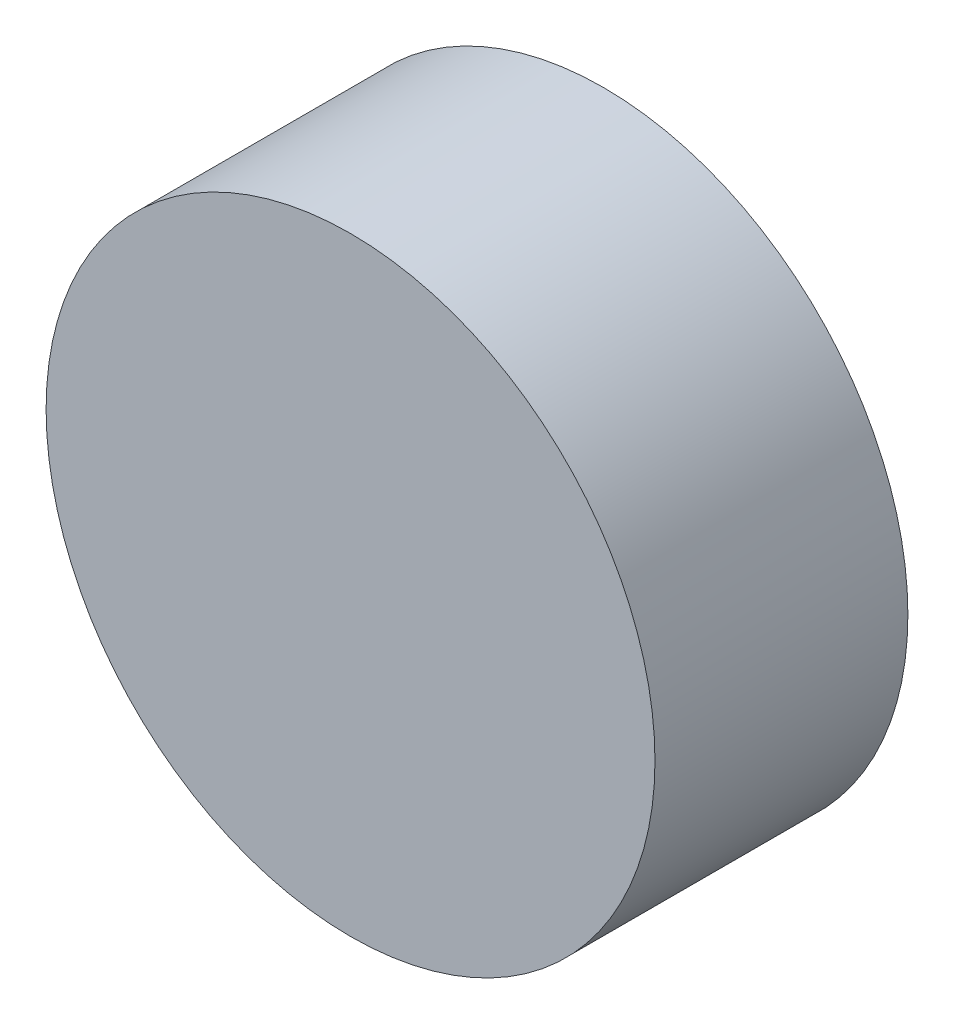
ISO-10303-21;
HEADER;
FILE_DESCRIPTION(('STEP AP214'),'2;1');
FILE_NAME('part.step','',(''),(''),'','','');
FILE_SCHEMA(('AUTOMOTIVE_DESIGN { 1 0 10303 214 1 1 1 1 }'));
ENDSEC;
DATA;
#1=APPLICATION_CONTEXT('core data for automotive mechanical design processes');
#2=APPLICATION_PROTOCOL_DEFINITION('international standard','automotive_design',2000,#1);
#3=PRODUCT_CONTEXT('',#1,'mechanical');
#4=PRODUCT('Part','Part','',(#3));
#5=PRODUCT_RELATED_PRODUCT_CATEGORY('part','',(#4));
#6=PRODUCT_DEFINITION_FORMATION('','',#4);
#7=PRODUCT_DEFINITION_CONTEXT('part definition',#1,'design');
#8=PRODUCT_DEFINITION('design','',#6,#7);
#9=PRODUCT_DEFINITION_SHAPE('','',#8);
#10=(LENGTH_UNIT() NAMED_UNIT(*) SI_UNIT(.MILLI.,.METRE.));
#11=(NAMED_UNIT(*) PLANE_ANGLE_UNIT() SI_UNIT($,.RADIAN.));
#12=(NAMED_UNIT(*) SI_UNIT($,.STERADIAN.) SOLID_ANGLE_UNIT());
#13=UNCERTAINTY_MEASURE_WITH_UNIT(LENGTH_MEASURE(1.E-05),#10,'distance_accuracy_value','');
#14=(GEOMETRIC_REPRESENTATION_CONTEXT(3) GLOBAL_UNCERTAINTY_ASSIGNED_CONTEXT((#13)) GLOBAL_UNIT_ASSIGNED_CONTEXT((#10,
#11,#12)) REPRESENTATION_CONTEXT('',''));
#15=CARTESIAN_POINT('',(0.,0.,0.));
#16=DIRECTION('',(0.,0.,1.));
#17=DIRECTION('',(1.,0.,0.));
#18=AXIS2_PLACEMENT_3D('',#15,#16,#17);
#19=CARTESIAN_POINT('',(0.,0.,27.));
#20=DIRECTION('',(0.,0.,-1.));
#21=DIRECTION('',(-1.,0.,0.));
#22=AXIS2_PLACEMENT_3D('',#19,#20,#21);
#23=CYLINDRICAL_SURFACE('',#22,32.5);
#24=CARTESIAN_POINT('',(0.,0.,27.));
#25=DIRECTION('',(0.,0.,1.));
#26=DIRECTION('',(1.,0.,0.));
#27=AXIS2_PLACEMENT_3D('',#24,#25,#26);
#28=CIRCLE('',#27,32.5);
#29=CARTESIAN_POINT('',(32.5,0.,27.));
#30=VERTEX_POINT('',#29);
#31=EDGE_CURVE('E11',#30,#30,#28,.T.);
#32=ORIENTED_EDGE('',*,*,#31,.F.);
#33=EDGE_LOOP('',(#32));
#34=FACE_BOUND('',#33,.T.);
#35=CARTESIAN_POINT('',(0.,0.,0.));
#36=DIRECTION('',(0.,0.,1.));
#37=DIRECTION('',(1.,0.,0.));
#38=AXIS2_PLACEMENT_3D('',#35,#36,#37);
#39=CIRCLE('',#38,32.5);
#40=CARTESIAN_POINT('',(32.5,0.,0.));
#41=VERTEX_POINT('',#40);
#42=EDGE_CURVE('E38',#41,#41,#39,.T.);
#43=ORIENTED_EDGE('',*,*,#42,.T.);
#44=EDGE_LOOP('',(#43));
#45=FACE_BOUND('',#44,.T.);
#46=ADVANCED_FACE('F35',(#34,#45),#23,.T.);
#47=CARTESIAN_POINT('',(0.,0.,27.));
#48=DIRECTION('',(0.,0.,1.));
#49=DIRECTION('',(1.,0.,0.));
#50=AXIS2_PLACEMENT_3D('',#47,#48,#49);
#51=PLANE('',#50);
#52=ORIENTED_EDGE('',*,*,#31,.T.);
#53=EDGE_LOOP('',(#52));
#54=FACE_BOUND('',#53,.T.);
#55=ADVANCED_FACE('F152',(#54),#51,.T.);
#56=CARTESIAN_POINT('',(0.,0.,0.));
#57=DIRECTION('',(0.,0.,1.));
#58=DIRECTION('',(1.,0.,0.));
#59=AXIS2_PLACEMENT_3D('',#56,#57,#58);
#60=PLANE('',#59);
#61=CARTESIAN_POINT('',(0.,0.,0.));
#62=DIRECTION('',(0.,0.,-1.));
#63=DIRECTION('',(-1.,0.,0.));
#64=AXIS2_PLACEMENT_3D('',#61,#62,#63);
#65=CIRCLE('',#64,20.);
#66=CARTESIAN_POINT('',(-20.,0.,0.));
#67=VERTEX_POINT('',#66);
#68=EDGE_CURVE('E135',#67,#67,#65,.T.);
#69=ORIENTED_EDGE('',*,*,#68,.F.);
#70=EDGE_LOOP('',(#69));
#71=FACE_BOUND('',#70,.T.);
#72=ORIENTED_EDGE('',*,*,#42,.F.);
#73=EDGE_LOOP('',(#72));
#74=FACE_BOUND('',#73,.T.);
#75=ADVANCED_FACE('F149',(#71,#74),#60,.F.);
#76=CARTESIAN_POINT('',(0.,0.,10.));
#77=DIRECTION('',(0.,0.,-1.));
#78=DIRECTION('',(-1.,0.,0.));
#79=AXIS2_PLACEMENT_3D('',#76,#77,#78);
#80=CYLINDRICAL_SURFACE('',#79,20.);
#81=CARTESIAN_POINT('',(0.,0.,10.));
#82=DIRECTION('',(0.,0.,-1.));
#83=DIRECTION('',(-1.,0.,0.));
#84=AXIS2_PLACEMENT_3D('',#81,#82,#83);
#85=CIRCLE('',#84,20.);
#86=CARTESIAN_POINT('',(-20.,0.,10.));
#87=VERTEX_POINT('',#86);
#88=EDGE_CURVE('E141',#87,#87,#85,.T.);
#89=ORIENTED_EDGE('',*,*,#88,.F.);
#90=EDGE_LOOP('',(#89));
#91=FACE_BOUND('',#90,.T.);
#92=ORIENTED_EDGE('',*,*,#68,.T.);
#93=EDGE_LOOP('',(#92));
#94=FACE_BOUND('',#93,.T.);
#95=ADVANCED_FACE('F147',(#91,#94),#80,.F.);
#96=CARTESIAN_POINT('',(0.,0.,10.));
#97=DIRECTION('',(0.,0.,-1.));
#98=DIRECTION('',(-1.,0.,0.));
#99=AXIS2_PLACEMENT_3D('',#96,#97,#98);
#100=PLANE('',#99);
#101=DIRECTION('',(0.,1.,0.));
#102=VECTOR('',#101,1.);
#103=CARTESIAN_POINT('',(-6.,-3.46410161513775,10.));
#104=LINE('',#103,#102);
#105=CARTESIAN_POINT('',(-6.,-3.46410161513775,10.));
#106=VERTEX_POINT('',#105);
#107=CARTESIAN_POINT('',(-6.,3.46410161513775,10.));
#108=VERTEX_POINT('',#107);
#109=EDGE_CURVE('E121',#106,#108,#104,.T.);
#110=ORIENTED_EDGE('',*,*,#109,.F.);
#111=DIRECTION('',(-0.866025403784438,0.5,0.));
#112=VECTOR('',#111,1.);
#113=CARTESIAN_POINT('',(0.,-6.92820323027551,10.));
#114=LINE('',#113,#112);
#115=CARTESIAN_POINT('',(0.,-6.92820323027551,10.));
#116=VERTEX_POINT('',#115);
#117=EDGE_CURVE('E131',#116,#106,#114,.T.);
#118=ORIENTED_EDGE('',*,*,#117,.F.);
#119=DIRECTION('',(-0.866025403784439,-0.5,0.));
#120=VECTOR('',#119,1.);
#121=CARTESIAN_POINT('',(6.,-3.46410161513775,10.));
#122=LINE('',#121,#120);
#123=CARTESIAN_POINT('',(6.,-3.46410161513775,10.));
#124=VERTEX_POINT('',#123);
#125=EDGE_CURVE('E49',#124,#116,#122,.T.);
#126=ORIENTED_EDGE('',*,*,#125,.F.);
#127=DIRECTION('',(0.,-1.,0.));
#128=VECTOR('',#127,1.);
#129=CARTESIAN_POINT('',(6.,3.46410161513775,10.));
#130=LINE('',#129,#128);
#131=CARTESIAN_POINT('',(6.,3.46410161513775,10.));
#132=VERTEX_POINT('',#131);
#133=EDGE_CURVE('E99',#132,#124,#130,.T.);
#134=ORIENTED_EDGE('',*,*,#133,.F.);
#135=DIRECTION('',(0.866025403784439,-0.5,0.));
#136=VECTOR('',#135,1.);
#137=CARTESIAN_POINT('',(0.,6.92820323027551,10.));
#138=LINE('',#137,#136);
#139=CARTESIAN_POINT('',(0.,6.92820323027551,10.));
#140=VERTEX_POINT('',#139);
#141=EDGE_CURVE('E126',#140,#132,#138,.T.);
#142=ORIENTED_EDGE('',*,*,#141,.F.);
#143=DIRECTION('',(0.866025403784439,0.5,0.));
#144=VECTOR('',#143,1.);
#145=CARTESIAN_POINT('',(-6.,3.46410161513775,10.));
#146=LINE('',#145,#144);
#147=EDGE_CURVE('E123',#108,#140,#146,.T.);
#148=ORIENTED_EDGE('',*,*,#147,.F.);
#149=EDGE_LOOP('',(#110,#118,#126,#134,#142,#148));
#150=FACE_BOUND('',#149,.T.);
#151=ORIENTED_EDGE('',*,*,#88,.T.);
#152=EDGE_LOOP('',(#151));
#153=FACE_BOUND('',#152,.T.);
#154=ADVANCED_FACE('F169',(#150,#153),#100,.T.);
#155=CARTESIAN_POINT('',(-6.,-3.46410161513775,16.));
#156=DIRECTION('',(-1.,0.,0.));
#157=DIRECTION('',(0.,-1.,0.));
#158=AXIS2_PLACEMENT_3D('',#155,#156,#157);
#159=PLANE('',#158);
#160=ORIENTED_EDGE('',*,*,#109,.T.);
#161=DIRECTION('',(0.,0.,-1.));
#162=VECTOR('',#161,1.);
#163=CARTESIAN_POINT('',(-6.,3.46410161513775,16.));
#164=LINE('',#163,#162);
#165=CARTESIAN_POINT('',(-6.,3.46410161513775,16.));
#166=VERTEX_POINT('',#165);
#167=EDGE_CURVE('E81',#166,#108,#164,.T.);
#168=ORIENTED_EDGE('',*,*,#167,.F.);
#169=DIRECTION('',(0.,1.,0.));
#170=VECTOR('',#169,1.);
#171=CARTESIAN_POINT('',(-6.,-3.46410161513775,16.));
#172=LINE('',#171,#170);
#173=CARTESIAN_POINT('',(-6.,-3.46410161513775,16.));
#174=VERTEX_POINT('',#173);
#175=EDGE_CURVE('E133',#174,#166,#172,.T.);
#176=ORIENTED_EDGE('',*,*,#175,.F.);
#177=DIRECTION('',(0.,0.,-1.));
#178=VECTOR('',#177,1.);
#179=CARTESIAN_POINT('',(-6.,-3.46410161513775,16.));
#180=LINE('',#179,#178);
#181=EDGE_CURVE('E58',#174,#106,#180,.T.);
#182=ORIENTED_EDGE('',*,*,#181,.T.);
#183=EDGE_LOOP('',(#160,#168,#176,#182));
#184=FACE_BOUND('',#183,.T.);
#185=ADVANCED_FACE('F173',(#184),#159,.F.);
#186=CARTESIAN_POINT('',(0.,-6.92820323027551,16.));
#187=DIRECTION('',(-0.5,-0.866025403784439,0.));
#188=DIRECTION('',(0.866025403784439,-0.5,0.));
#189=AXIS2_PLACEMENT_3D('',#186,#187,#188);
#190=PLANE('',#189);
#191=ORIENTED_EDGE('',*,*,#117,.T.);
#192=ORIENTED_EDGE('',*,*,#181,.F.);
#193=DIRECTION('',(-0.866025403784438,0.5,0.));
#194=VECTOR('',#193,1.);
#195=CARTESIAN_POINT('',(0.,-6.92820323027551,16.));
#196=LINE('',#195,#194);
#197=CARTESIAN_POINT('',(0.,-6.92820323027551,16.));
#198=VERTEX_POINT('',#197);
#199=EDGE_CURVE('E108',#198,#174,#196,.T.);
#200=ORIENTED_EDGE('',*,*,#199,.F.);
#201=DIRECTION('',(0.,0.,-1.));
#202=VECTOR('',#201,1.);
#203=CARTESIAN_POINT('',(0.,-6.92820323027551,16.));
#204=LINE('',#203,#202);
#205=EDGE_CURVE('E100',#198,#116,#204,.T.);
#206=ORIENTED_EDGE('',*,*,#205,.T.);
#207=EDGE_LOOP('',(#191,#192,#200,#206));
#208=FACE_BOUND('',#207,.T.);
#209=ADVANCED_FACE('F177',(#208),#190,.F.);
#210=CARTESIAN_POINT('',(6.,-3.46410161513775,16.));
#211=DIRECTION('',(0.5,-0.866025403784438,0.));
#212=DIRECTION('',(0.866025403784439,0.5,0.));
#213=AXIS2_PLACEMENT_3D('',#210,#211,#212);
#214=PLANE('',#213);
#215=ORIENTED_EDGE('',*,*,#125,.T.);
#216=ORIENTED_EDGE('',*,*,#205,.F.);
#217=DIRECTION('',(-0.866025403784439,-0.5,0.));
#218=VECTOR('',#217,1.);
#219=CARTESIAN_POINT('',(6.,-3.46410161513775,16.));
#220=LINE('',#219,#218);
#221=CARTESIAN_POINT('',(6.,-3.46410161513775,16.));
#222=VERTEX_POINT('',#221);
#223=EDGE_CURVE('E104',#222,#198,#220,.T.);
#224=ORIENTED_EDGE('',*,*,#223,.F.);
#225=DIRECTION('',(0.,0.,-1.));
#226=VECTOR('',#225,1.);
#227=CARTESIAN_POINT('',(6.,-3.46410161513775,16.));
#228=LINE('',#227,#226);
#229=EDGE_CURVE('E92',#222,#124,#228,.T.);
#230=ORIENTED_EDGE('',*,*,#229,.T.);
#231=EDGE_LOOP('',(#215,#216,#224,#230));
#232=FACE_BOUND('',#231,.T.);
#233=ADVANCED_FACE('F105',(#232),#214,.F.);
#234=CARTESIAN_POINT('',(6.,3.46410161513775,16.));
#235=DIRECTION('',(1.,0.,0.));
#236=DIRECTION('',(0.,1.,0.));
#237=AXIS2_PLACEMENT_3D('',#234,#235,#236);
#238=PLANE('',#237);
#239=ORIENTED_EDGE('',*,*,#133,.T.);
#240=ORIENTED_EDGE('',*,*,#229,.F.);
#241=DIRECTION('',(0.,-1.,0.));
#242=VECTOR('',#241,1.);
#243=CARTESIAN_POINT('',(6.,3.46410161513775,16.));
#244=LINE('',#243,#242);
#245=CARTESIAN_POINT('',(6.,3.46410161513775,16.));
#246=VERTEX_POINT('',#245);
#247=EDGE_CURVE('E96',#246,#222,#244,.T.);
#248=ORIENTED_EDGE('',*,*,#247,.F.);
#249=DIRECTION('',(0.,0.,-1.));
#250=VECTOR('',#249,1.);
#251=CARTESIAN_POINT('',(6.,3.46410161513775,16.));
#252=LINE('',#251,#250);
#253=EDGE_CURVE('E101',#246,#132,#252,.T.);
#254=ORIENTED_EDGE('',*,*,#253,.T.);
#255=EDGE_LOOP('',(#239,#240,#248,#254));
#256=FACE_BOUND('',#255,.T.);
#257=ADVANCED_FACE('F94',(#256),#238,.F.);
#258=CARTESIAN_POINT('',(0.,6.92820323027551,16.));
#259=DIRECTION('',(0.5,0.866025403784439,0.));
#260=DIRECTION('',(-0.866025403784439,0.5,0.));
#261=AXIS2_PLACEMENT_3D('',#258,#259,#260);
#262=PLANE('',#261);
#263=ORIENTED_EDGE('',*,*,#141,.T.);
#264=ORIENTED_EDGE('',*,*,#253,.F.);
#265=DIRECTION('',(0.866025403784439,-0.5,0.));
#266=VECTOR('',#265,1.);
#267=CARTESIAN_POINT('',(0.,6.92820323027551,16.));
#268=LINE('',#267,#266);
#269=CARTESIAN_POINT('',(0.,6.92820323027551,16.));
#270=VERTEX_POINT('',#269);
#271=EDGE_CURVE('E114',#270,#246,#268,.T.);
#272=ORIENTED_EDGE('',*,*,#271,.F.);
#273=DIRECTION('',(0.,0.,-1.));
#274=VECTOR('',#273,1.);
#275=CARTESIAN_POINT('',(0.,6.92820323027551,16.));
#276=LINE('',#275,#274);
#277=EDGE_CURVE('E138',#270,#140,#276,.T.);
#278=ORIENTED_EDGE('',*,*,#277,.T.);
#279=EDGE_LOOP('',(#263,#264,#272,#278));
#280=FACE_BOUND('',#279,.T.);
#281=ADVANCED_FACE('F181',(#280),#262,.F.);
#282=CARTESIAN_POINT('',(-6.,3.46410161513775,16.));
#283=DIRECTION('',(-0.5,0.866025403784439,0.));
#284=DIRECTION('',(-0.866025403784439,-0.5,0.));
#285=AXIS2_PLACEMENT_3D('',#282,#283,#284);
#286=PLANE('',#285);
#287=ORIENTED_EDGE('',*,*,#147,.T.);
#288=ORIENTED_EDGE('',*,*,#277,.F.);
#289=DIRECTION('',(0.866025403784439,0.5,0.));
#290=VECTOR('',#289,1.);
#291=CARTESIAN_POINT('',(-6.,3.46410161513775,16.));
#292=LINE('',#291,#290);
#293=EDGE_CURVE('E116',#166,#270,#292,.T.);
#294=ORIENTED_EDGE('',*,*,#293,.F.);
#295=ORIENTED_EDGE('',*,*,#167,.T.);
#296=EDGE_LOOP('',(#287,#288,#294,#295));
#297=FACE_BOUND('',#296,.T.);
#298=ADVANCED_FACE('F178',(#297),#286,.F.);
#299=CARTESIAN_POINT('',(0.,0.,16.));
#300=DIRECTION('',(0.,0.,-1.));
#301=DIRECTION('',(-1.,0.,0.));
#302=AXIS2_PLACEMENT_3D('',#299,#300,#301);
#303=PLANE('',#302);
#304=ORIENTED_EDGE('',*,*,#175,.T.);
#305=ORIENTED_EDGE('',*,*,#293,.T.);
#306=ORIENTED_EDGE('',*,*,#271,.T.);
#307=ORIENTED_EDGE('',*,*,#247,.T.);
#308=ORIENTED_EDGE('',*,*,#223,.T.);
#309=ORIENTED_EDGE('',*,*,#199,.T.);
#310=EDGE_LOOP('',(#304,#305,#306,#307,#308,#309));
#311=FACE_BOUND('',#310,.T.);
#312=ADVANCED_FACE('F111',(#311),#303,.T.);
#313=CLOSED_SHELL('',(#46,#55,#75,#95,#154,#185,#209,#233,#257,#281,#298,#312));
#314=MANIFOLD_SOLID_BREP('B2',#313);
#315=ADVANCED_BREP_SHAPE_REPRESENTATION('',(#18,#314),#14);
#316=SHAPE_DEFINITION_REPRESENTATION(#9,#315);
ENDSEC;
END-ISO-10303-21;
